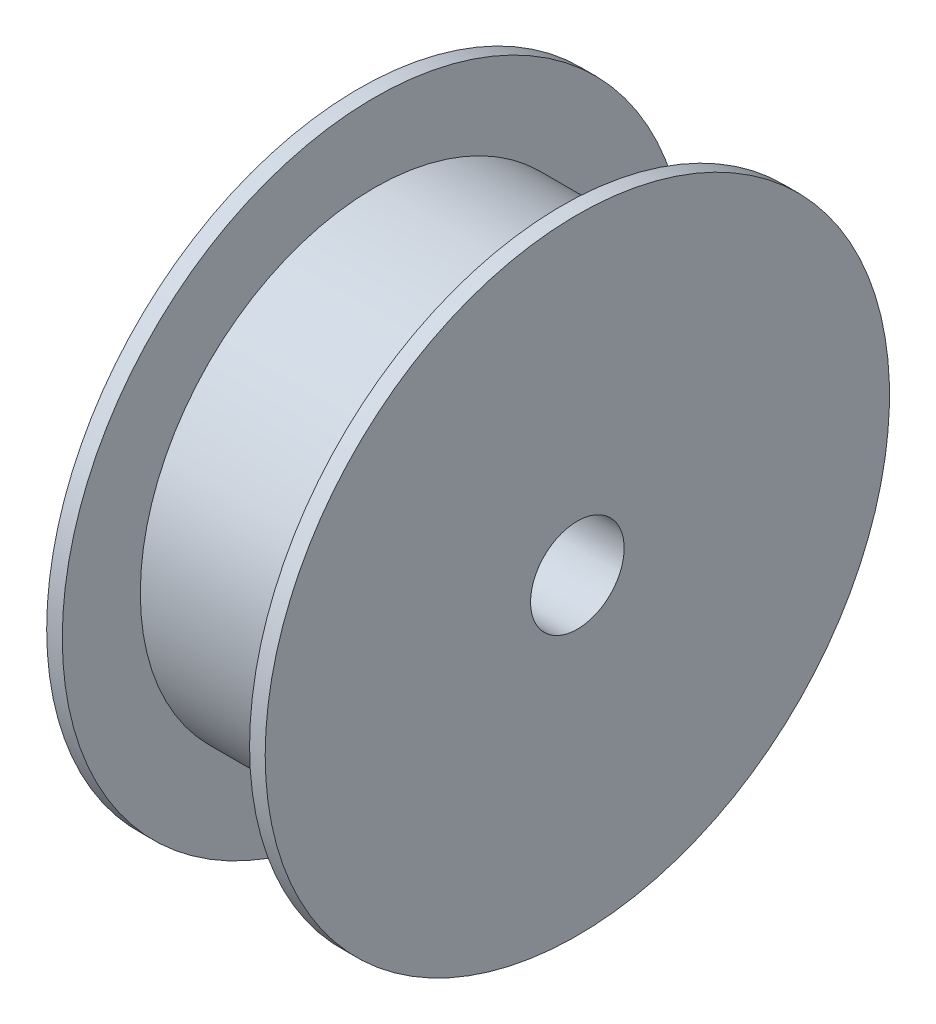
ISO-10303-21;
HEADER;
FILE_DESCRIPTION(('STEP AP214'),'2;1');
FILE_NAME('part.step','',(''),(''),'','','');
FILE_SCHEMA(('AUTOMOTIVE_DESIGN { 1 0 10303 214 1 1 1 1 }'));
ENDSEC;
DATA;
#1=APPLICATION_CONTEXT('core data for automotive mechanical design processes');
#2=APPLICATION_PROTOCOL_DEFINITION('international standard','automotive_design',2000,#1);
#3=PRODUCT_CONTEXT('',#1,'mechanical');
#4=PRODUCT('Part','Part','',(#3));
#5=PRODUCT_RELATED_PRODUCT_CATEGORY('part','',(#4));
#6=PRODUCT_DEFINITION_FORMATION('','',#4);
#7=PRODUCT_DEFINITION_CONTEXT('part definition',#1,'design');
#8=PRODUCT_DEFINITION('design','',#6,#7);
#9=PRODUCT_DEFINITION_SHAPE('','',#8);
#10=(LENGTH_UNIT() NAMED_UNIT(*) SI_UNIT(.MILLI.,.METRE.));
#11=(NAMED_UNIT(*) PLANE_ANGLE_UNIT() SI_UNIT($,.RADIAN.));
#12=(NAMED_UNIT(*) SI_UNIT($,.STERADIAN.) SOLID_ANGLE_UNIT());
#13=UNCERTAINTY_MEASURE_WITH_UNIT(LENGTH_MEASURE(1.E-05),#10,'distance_accuracy_value','');
#14=(GEOMETRIC_REPRESENTATION_CONTEXT(3) GLOBAL_UNCERTAINTY_ASSIGNED_CONTEXT((#13)) GLOBAL_UNIT_ASSIGNED_CONTEXT((#10,
#11,#12)) REPRESENTATION_CONTEXT('',''));
#15=CARTESIAN_POINT('',(0.,0.,0.));
#16=DIRECTION('',(0.,0.,1.));
#17=DIRECTION('',(1.,0.,0.));
#18=AXIS2_PLACEMENT_3D('',#15,#16,#17);
#19=CARTESIAN_POINT('',(-49.8494068842632,0.,20.0560361776407));
#20=DIRECTION('',(-1.,0.,0.));
#21=DIRECTION('',(0.,0.,1.));
#22=AXIS2_PLACEMENT_3D('',#19,#20,#21);
#23=CYLINDRICAL_SURFACE('',#22,20.);
#24=CARTESIAN_POINT('',(-44.7308545798672,0.,20.0560361776407));
#25=DIRECTION('',(-1.,0.,0.));
#26=DIRECTION('',(0.,0.,1.));
#27=AXIS2_PLACEMENT_3D('',#24,#25,#26);
#28=CIRCLE('',#27,20.);
#29=CARTESIAN_POINT('',(-44.7308545798672,0.,40.0560361776407));
#30=VERTEX_POINT('',#29);
#31=EDGE_CURVE('E63',#30,#30,#28,.T.);
#32=ORIENTED_EDGE('',*,*,#31,.F.);
#33=EDGE_LOOP('',(#32));
#34=FACE_BOUND('',#33,.T.);
#35=CARTESIAN_POINT('',(-43.7308545798672,0.,20.0560361776407));
#36=DIRECTION('',(-1.,0.,0.));
#37=DIRECTION('',(0.,0.,1.));
#38=AXIS2_PLACEMENT_3D('',#35,#36,#37);
#39=CIRCLE('',#38,20.);
#40=CARTESIAN_POINT('',(-43.7308545798672,0.,40.0560361776407));
#41=VERTEX_POINT('',#40);
#42=EDGE_CURVE('E10',#41,#41,#39,.T.);
#43=ORIENTED_EDGE('',*,*,#42,.T.);
#44=EDGE_LOOP('',(#43));
#45=FACE_BOUND('',#44,.T.);
#46=ADVANCED_FACE('F31',(#34,#45),#23,.T.);
#47=CARTESIAN_POINT('',(-43.7308545798672,0.,0.0560361776407448));
#48=DIRECTION('',(-1.,0.,0.));
#49=DIRECTION('',(0.,0.,1.));
#50=AXIS2_PLACEMENT_3D('',#47,#48,#49);
#51=PLANE('',#50);
#52=ORIENTED_EDGE('',*,*,#42,.F.);
#53=EDGE_LOOP('',(#52));
#54=FACE_BOUND('',#53,.T.);
#55=CARTESIAN_POINT('',(-43.7308545798672,0.,20.0560361776407));
#56=DIRECTION('',(-1.,0.,0.));
#57=DIRECTION('',(0.,0.,1.));
#58=AXIS2_PLACEMENT_3D('',#55,#56,#57);
#59=CIRCLE('',#58,15.);
#60=CARTESIAN_POINT('',(-43.7308545798672,0.,35.0560361776407));
#61=VERTEX_POINT('',#60);
#62=EDGE_CURVE('E42',#61,#61,#59,.T.);
#63=ORIENTED_EDGE('',*,*,#62,.T.);
#64=EDGE_LOOP('',(#63));
#65=FACE_BOUND('',#64,.T.);
#66=ADVANCED_FACE('F101',(#54,#65),#51,.F.);
#67=CARTESIAN_POINT('',(-49.8494068842632,0.,20.0560361776407));
#68=DIRECTION('',(-1.,0.,0.));
#69=DIRECTION('',(0.,0.,1.));
#70=AXIS2_PLACEMENT_3D('',#67,#68,#69);
#71=CYLINDRICAL_SURFACE('',#70,15.);
#72=CARTESIAN_POINT('',(-37.7308545798672,-14.9144225500017,21.6560361776407));
#73=CARTESIAN_POINT('',(-37.6412565888924,-14.9144236655933,21.6560323127364));
#74=CARTESIAN_POINT('',(-37.5516001486898,-14.9152386417625,21.6484847560006));
#75=CARTESIAN_POINT('',(-37.3747753240401,-14.9184098476283,21.6184913808744));
#76=CARTESIAN_POINT('',(-37.2876097544806,-14.9207677542496,21.5960293523893));
#77=CARTESIAN_POINT('',(-37.1183528283659,-14.9267547699762,21.5368705670349));
#78=CARTESIAN_POINT('',(-37.0362583425626,-14.9303830857339,21.5001826924183));
#79=CARTESIAN_POINT('',(-36.8794093412271,-14.9385011292845,21.4136312202387));
#80=CARTESIAN_POINT('',(-36.8046534216364,-14.9429906918111,21.3637701498155));
#81=CARTESIAN_POINT('',(-36.6642787395788,-14.9523460689031,21.2520673578389));
#82=CARTESIAN_POINT('',(-36.5986944731294,-14.9572132022761,21.1901823919092));
#83=CARTESIAN_POINT('',(-36.4788220851314,-14.9667633778283,21.0562811269401));
#84=CARTESIAN_POINT('',(-36.4245344912235,-14.9714464114003,20.9842643549312));
#85=CARTESIAN_POINT('',(-36.3286759368629,-14.9801139039791,20.8319308435279));
#86=CARTESIAN_POINT('',(-36.2871357055182,-14.9840966651839,20.7515946624799));
#87=CARTESIAN_POINT('',(-36.2181476904811,-14.9909004707378,20.585037492711));
#88=CARTESIAN_POINT('',(-36.1906995194533,-14.9937215470167,20.4988166658096));
#89=CARTESIAN_POINT('',(-36.1507764975354,-14.9978748574594,20.3232875577804));
#90=CARTESIAN_POINT('',(-36.1382447767579,-14.9992127450233,20.2339923472546));
#91=CARTESIAN_POINT('',(-36.1283343494322,-15.0002681826757,20.0545568302117));
#92=CARTESIAN_POINT('',(-36.1309552000684,-14.9999857801152,19.9644165484678));
#93=CARTESIAN_POINT('',(-36.1512295000159,-14.9978370703299,19.7862359121619));
#94=CARTESIAN_POINT('',(-36.168821795094,-14.9959772067036,19.6981885105843));
#95=CARTESIAN_POINT('',(-36.2184442527998,-14.9908899262437,19.5263031148105));
#96=CARTESIAN_POINT('',(-36.250474624907,-14.9876624895682,19.4424651817084));
#97=CARTESIAN_POINT('',(-36.3281305677545,-14.9801917630767,19.2811866509887));
#98=CARTESIAN_POINT('',(-36.3737830534523,-14.9759464654356,19.203759109756));
#99=CARTESIAN_POINT('',(-36.4773677663219,-14.9669160371749,19.0576417042459));
#100=CARTESIAN_POINT('',(-36.5353004035534,-14.962130888531,18.9889521318701));
#101=CARTESIAN_POINT('',(-36.662144514172,-14.9525292725756,18.8619020477762));
#102=CARTESIAN_POINT('',(-36.7311092110492,-14.9477127679481,18.803594663104));
#103=CARTESIAN_POINT('',(-36.877875674098,-14.9386149965148,18.699375784939));
#104=CARTESIAN_POINT('',(-36.9556774561651,-14.9343337306718,18.6534643137436));
#105=CARTESIAN_POINT('',(-37.1179520033578,-14.9267909175718,18.5753399745346));
#106=CARTESIAN_POINT('',(-37.2024264760579,-14.9235296323989,18.5431306265151));
#107=CARTESIAN_POINT('',(-37.3756272299974,-14.9184013871239,18.4933681173521));
#108=CARTESIAN_POINT('',(-37.4643533633038,-14.9165343785466,18.4758144466671));
#109=CARTESIAN_POINT('',(-37.6430717421569,-14.9144146003332,18.4559304092112));
#110=CARTESIAN_POINT('',(-37.7330556165361,-14.914153938196,18.4535256098236));
#111=CARTESIAN_POINT('',(-37.9121450214029,-14.9152555286042,18.4638118773613));
#112=CARTESIAN_POINT('',(-38.0012505654055,-14.9166177561386,18.4765027116408));
#113=CARTESIAN_POINT('',(-38.1758354801393,-14.9208044527218,18.5165576276903));
#114=CARTESIAN_POINT('',(-38.2613230649851,-14.9236253932699,18.5438863074639));
#115=CARTESIAN_POINT('',(-38.4265011121702,-14.9304088072498,18.6124049388579));
#116=CARTESIAN_POINT('',(-38.5061914240119,-14.9343713103036,18.6535952501712));
#117=CARTESIAN_POINT('',(-38.6578514629253,-14.9430104351993,18.7488535148471));
#118=CARTESIAN_POINT('',(-38.7297901321486,-14.9476897601603,18.8029706661976));
#119=CARTESIAN_POINT('',(-38.8635893871637,-14.9572265334338,18.9224761470013));
#120=CARTESIAN_POINT('',(-38.9254496886995,-14.9620839867655,18.9878647942552));
#121=CARTESIAN_POINT('',(-39.037594077137,-14.9714536371823,19.1283805843653));
#122=CARTESIAN_POINT('',(-39.0878295202163,-14.9759643325541,19.2035466635937));
#123=CARTESIAN_POINT('',(-39.1749630080714,-14.9841102341174,19.3612920433897));
#124=CARTESIAN_POINT('',(-39.2118612572873,-14.9877454537285,19.4438712303009));
#125=CARTESIAN_POINT('',(-39.2711910403719,-14.9937240629098,19.6139309143894));
#126=CARTESIAN_POINT('',(-39.2936516420748,-14.9960700467537,19.7014011755621));
#127=CARTESIAN_POINT('',(-39.3235633531027,-14.9992165342767,19.8788978045657));
#128=CARTESIAN_POINT('',(-39.3310149465423,-15.0000170878034,19.9689240898571));
#129=CARTESIAN_POINT('',(-39.3306897683637,-14.9999824379928,20.1485001655406));
#130=CARTESIAN_POINT('',(-39.3229883842556,-14.9991553324116,20.2380501035077));
#131=CARTESIAN_POINT('',(-39.2927343370414,-14.9959742980278,20.4145760913493));
#132=CARTESIAN_POINT('',(-39.2701816669227,-14.9936203685045,20.5015521400084));
#133=CARTESIAN_POINT('',(-39.2108868324186,-14.9876492980642,20.6704585051961));
#134=CARTESIAN_POINT('',(-39.1741472288251,-14.9840323851315,20.7523897292405));
#135=CARTESIAN_POINT('',(-39.0875293559588,-14.9759378682743,20.9089348387753));
#136=CARTESIAN_POINT('',(-39.0376511055162,-14.9714602655833,20.9835487347525));
#137=CARTESIAN_POINT('',(-38.9258898303516,-14.9621189097809,21.1237273565908));
#138=CARTESIAN_POINT('',(-38.8639506378233,-14.9572534154219,21.1892471864386));
#139=CARTESIAN_POINT('',(-38.7299386060694,-14.9476992164899,21.3089953406162));
#140=CARTESIAN_POINT('',(-38.6578633473456,-14.9430105544671,21.3632209613069));
#141=CARTESIAN_POINT('',(-38.5053963885181,-14.9343265816053,21.458966837947));
#142=CARTESIAN_POINT('',(-38.4249815241576,-14.9303332892578,21.5004503644136));
#143=CARTESIAN_POINT('',(-38.258334463341,-14.9235160982773,21.569269161836));
#144=CARTESIAN_POINT('',(-38.1721088938709,-14.9206908928619,21.5966202518801));
#145=CARTESIAN_POINT('',(-38.0263131951117,-14.9172357939645,21.6296435128485));
#146=CARTESIAN_POINT('',(-37.9676723529666,-14.916185880525,21.6395270656153));
#147=CARTESIAN_POINT('',(-37.8496477639283,-14.9147788904034,21.6527246630897));
#148=CARTESIAN_POINT('',(-37.7902640207155,-14.9144218102902,21.65603874033));
#149=CARTESIAN_POINT('',(-37.7308545798672,-14.9144225500017,21.6560361776407));
#150=B_SPLINE_CURVE_WITH_KNOTS('',3,(#72,#73,#74,#75,#76,#77,#78,#79,#80,#81,#82,#83,#84,#85,
#86,#87,#88,#89,#90,#91,#92,#93,#94,#95,#96,#97,#98,#99,#100,#101,#102,#103,#104,#105,#106,#107,
#108,#109,#110,#111,#112,#113,#114,#115,#116,#117,#118,#119,#120,#121,#122,#123,#124,#125,#126,
#127,#128,#129,#130,#131,#132,#133,#134,#135,#136,#137,#138,#139,#140,#141,#142,#143,#144,#145,
#146,#147,#148,#149),.UNSPECIFIED.,.T.,.F.,(4,2,2,2,2,2,2,2,2,2,2,2,2,2,2,2,2,2,2,2,2,2,2,2,2,2,
2,2,2,2,2,2,2,2,2,2,2,2,4),(0.,0.268577001529124,0.537446390261954,0.806148173479042,
1.07479844645294,1.34443343913401,1.61408102300266,1.88437361023824,2.15465876779301,
2.42391011167973,2.69315358705864,2.96130252668383,3.22945535696219,3.49814155961667,
3.76683673567383,4.03686964273638,4.30690303552161,4.57700575645424,4.84709908619821,
5.11586429481954,5.3846253614294,5.65273933841567,5.92086027317743,6.19001837516274,
6.4591840673222,6.72945648996832,6.99972476955153,7.26944718972389,7.53916090987708,
7.80753617116474,8.07591155917663,8.34423852710792,8.61256511047858,8.8821725404879,
9.15184443588199,9.42228652782287,9.69242524206732,9.87051058001084,10.0485950360567),.UNSPECIFIED.);
#151=CARTESIAN_POINT('',(-37.7308545798672,-14.9144225500017,21.6560361776407));
#152=VERTEX_POINT('',#151);
#153=EDGE_CURVE('E66',#152,#152,#150,.T.);
#154=ORIENTED_EDGE('',*,*,#153,.T.);
#155=EDGE_LOOP('',(#154));
#156=FACE_BOUND('',#155,.T.);
#157=ORIENTED_EDGE('',*,*,#62,.F.);
#158=EDGE_LOOP('',(#157));
#159=FACE_BOUND('',#158,.T.);
#160=CARTESIAN_POINT('',(-31.7308545798672,0.,20.0560361776407));
#161=DIRECTION('',(-1.,0.,0.));
#162=DIRECTION('',(0.,0.,1.));
#163=AXIS2_PLACEMENT_3D('',#160,#161,#162);
#164=CIRCLE('',#163,15.);
#165=CARTESIAN_POINT('',(-31.7308545798672,0.,35.0560361776407));
#166=VERTEX_POINT('',#165);
#167=EDGE_CURVE('E46',#166,#166,#164,.T.);
#168=ORIENTED_EDGE('',*,*,#167,.T.);
#169=EDGE_LOOP('',(#168));
#170=FACE_BOUND('',#169,.T.);
#171=ADVANCED_FACE('F71',(#156,#159,#170),#71,.T.);
#172=CARTESIAN_POINT('',(-31.7308545798672,0.,5.05603617764075));
#173=DIRECTION('',(1.,0.,0.));
#174=DIRECTION('',(0.,0.,-1.));
#175=AXIS2_PLACEMENT_3D('',#172,#173,#174);
#176=PLANE('',#175);
#177=ORIENTED_EDGE('',*,*,#167,.F.);
#178=EDGE_LOOP('',(#177));
#179=FACE_BOUND('',#178,.T.);
#180=CARTESIAN_POINT('',(-31.7308545798672,0.,20.0560361776407));
#181=DIRECTION('',(-1.,0.,0.));
#182=DIRECTION('',(0.,0.,1.));
#183=AXIS2_PLACEMENT_3D('',#180,#181,#182);
#184=CIRCLE('',#183,20.);
#185=CARTESIAN_POINT('',(-31.7308545798672,0.,40.0560361776407));
#186=VERTEX_POINT('',#185);
#187=EDGE_CURVE('E51',#186,#186,#184,.T.);
#188=ORIENTED_EDGE('',*,*,#187,.T.);
#189=EDGE_LOOP('',(#188));
#190=FACE_BOUND('',#189,.T.);
#191=ADVANCED_FACE('F94',(#179,#190),#176,.F.);
#192=CARTESIAN_POINT('',(-49.8494068842632,0.,20.0560361776407));
#193=DIRECTION('',(-1.,0.,0.));
#194=DIRECTION('',(0.,0.,1.));
#195=AXIS2_PLACEMENT_3D('',#192,#193,#194);
#196=CYLINDRICAL_SURFACE('',#195,20.);
#197=ORIENTED_EDGE('',*,*,#187,.F.);
#198=EDGE_LOOP('',(#197));
#199=FACE_BOUND('',#198,.T.);
#200=CARTESIAN_POINT('',(-30.7308545798672,0.,20.0560361776407));
#201=DIRECTION('',(-1.,0.,0.));
#202=DIRECTION('',(0.,0.,1.));
#203=AXIS2_PLACEMENT_3D('',#200,#201,#202);
#204=CIRCLE('',#203,20.);
#205=CARTESIAN_POINT('',(-30.7308545798672,0.,40.0560361776407));
#206=VERTEX_POINT('',#205);
#207=EDGE_CURVE('E54',#206,#206,#204,.T.);
#208=ORIENTED_EDGE('',*,*,#207,.T.);
#209=EDGE_LOOP('',(#208));
#210=FACE_BOUND('',#209,.T.);
#211=ADVANCED_FACE('F91',(#199,#210),#196,.T.);
#212=CARTESIAN_POINT('',(-30.7308545798672,0.,0.0560361776407448));
#213=DIRECTION('',(-1.,0.,0.));
#214=DIRECTION('',(0.,0.,1.));
#215=AXIS2_PLACEMENT_3D('',#212,#213,#214);
#216=PLANE('',#215);
#217=ORIENTED_EDGE('',*,*,#207,.F.);
#218=EDGE_LOOP('',(#217));
#219=FACE_BOUND('',#218,.T.);
#220=CARTESIAN_POINT('',(-30.7308545798672,0.,20.0560361776407));
#221=DIRECTION('',(-1.,0.,0.));
#222=DIRECTION('',(0.,0.,1.));
#223=AXIS2_PLACEMENT_3D('',#220,#221,#222);
#224=CIRCLE('',#223,3.);
#225=CARTESIAN_POINT('',(-30.7308545798672,0.,23.0560361776407));
#226=VERTEX_POINT('',#225);
#227=EDGE_CURVE('E57',#226,#226,#224,.T.);
#228=ORIENTED_EDGE('',*,*,#227,.T.);
#229=EDGE_LOOP('',(#228));
#230=FACE_BOUND('',#229,.T.);
#231=ADVANCED_FACE('F87',(#219,#230),#216,.F.);
#232=CARTESIAN_POINT('',(-49.8494068842632,0.,20.0560361776407));
#233=DIRECTION('',(-1.,0.,0.));
#234=DIRECTION('',(0.,0.,1.));
#235=AXIS2_PLACEMENT_3D('',#232,#233,#234);
#236=CYLINDRICAL_SURFACE('',#235,3.);
#237=CARTESIAN_POINT('',(-37.7308545798672,-2.53771550808991,21.6560361776407));
#238=CARTESIAN_POINT('',(-37.8133291109379,-2.53772393406364,21.6560299066694));
#239=CARTESIAN_POINT('',(-37.8958871450626,-2.54179889267039,21.6496155074785));
#240=CARTESIAN_POINT('',(-38.0583962145882,-2.55747842808691,21.6243187596731));
#241=CARTESIAN_POINT('',(-38.1383422280576,-2.56909670494034,21.6054137246795));
#242=CARTESIAN_POINT('',(-38.2929589784302,-2.59811808393787,21.5562309701328));
#243=CARTESIAN_POINT('',(-38.3676578464484,-2.61548693810715,21.5260204456603));
#244=CARTESIAN_POINT('',(-38.510903040982,-2.65399774393998,21.4552906909458));
#245=CARTESIAN_POINT('',(-38.5794483675648,-2.67514030715828,21.4147697893846));
#246=CARTESIAN_POINT('',(-38.715584321778,-2.72125117018077,21.3200836813734));
#247=CARTESIAN_POINT('',(-38.7824711791149,-2.74639217607543,21.264990337683));
#248=CARTESIAN_POINT('',(-38.9066144693172,-2.79627920363343,21.1446446352452));
#249=CARTESIAN_POINT('',(-38.9638654904358,-2.82102499632022,21.0793866070849));
#250=CARTESIAN_POINT('',(-39.071574657024,-2.86967596680657,20.9342522733625));
#251=CARTESIAN_POINT('',(-39.1211336604137,-2.89335873670358,20.8536269933754));
#252=CARTESIAN_POINT('',(-39.2056586269121,-2.93490870170679,20.6836817275102));
#253=CARTESIAN_POINT('',(-39.2406350496267,-2.95278006311368,20.5943680304558));
#254=CARTESIAN_POINT('',(-39.2921012867139,-2.97943742818159,20.4170652068426));
#255=CARTESIAN_POINT('',(-39.3098350194684,-2.98883049226817,20.3295305888759));
#256=CARTESIAN_POINT('',(-39.3304435008519,-2.99976727249257,20.1522671237506));
#257=CARTESIAN_POINT('',(-39.333328707082,-3.00131651290873,20.062539865598));
#258=CARTESIAN_POINT('',(-39.3245582876511,-2.99664573852507,19.8929361777364));
#259=CARTESIAN_POINT('',(-39.3143086481941,-2.99117687625849,19.8129609552491));
#260=CARTESIAN_POINT('',(-39.282124251316,-2.97426467697561,19.656066241814));
#261=CARTESIAN_POINT('',(-39.2601886059384,-2.96282088595806,19.5791469835498));
#262=CARTESIAN_POINT('',(-39.2052015157862,-2.93481417272145,19.4293395338772));
#263=CARTESIAN_POINT('',(-39.1720199189211,-2.91819150486987,19.3565107479319));
#264=CARTESIAN_POINT('',(-39.0957095356393,-2.88126966802788,19.2172995654986));
#265=CARTESIAN_POINT('',(-39.0525774114209,-2.86096926587115,19.1509193427564));
#266=CARTESIAN_POINT('',(-38.9524878699046,-2.81605817372031,19.0191421651843));
#267=CARTESIAN_POINT('',(-38.8945612531171,-2.79121882485554,18.9545590344346));
#268=CARTESIAN_POINT('',(-38.7690814210516,-2.74127710464253,18.8355553509968));
#269=CARTESIAN_POINT('',(-38.7015191565041,-2.7161745068325,18.7811444637948));
#270=CARTESIAN_POINT('',(-38.5522017958493,-2.66632287248061,18.679750699116));
#271=CARTESIAN_POINT('',(-38.4697462429289,-2.64175951899934,18.6336982405269));
#272=CARTESIAN_POINT('',(-38.2966973976476,-2.59869198610644,18.5564453021343));
#273=CARTESIAN_POINT('',(-38.2061134739231,-2.5801809423682,18.5252279784608));
#274=CARTESIAN_POINT('',(-38.0270088519747,-2.5535330411015,18.4812069915379));
#275=CARTESIAN_POINT('',(-37.9389170228512,-2.54467635048958,18.4671148730164));
#276=CARTESIAN_POINT('',(-37.7612102406844,-2.53635141290432,18.4538515857176));
#277=CARTESIAN_POINT('',(-37.6715968489098,-2.53687406220241,18.4546659485004));
#278=CARTESIAN_POINT('',(-37.5061326480194,-2.54648293181075,18.470011024521));
#279=CARTESIAN_POINT('',(-37.4300327395979,-2.55442428651191,18.4827083964332));
#280=CARTESIAN_POINT('',(-37.2812322056786,-2.57618644887237,18.518603041831));
#281=CARTESIAN_POINT('',(-37.2085329252446,-2.59000956150206,18.541804431908));
#282=CARTESIAN_POINT('',(-37.0648814885139,-2.62267056864907,18.5990783854999));
#283=CARTESIAN_POINT('',(-36.9941492757251,-2.64170343208955,18.6335868741466));
#284=CARTESIAN_POINT('',(-36.8590577645035,-2.68251285406401,18.7121303090477));
#285=CARTESIAN_POINT('',(-36.7947017326615,-2.70429080608964,18.7561701018848));
#286=CARTESIAN_POINT('',(-36.6642652490294,-2.75198135746187,18.8600749639396));
#287=CARTESIAN_POINT('',(-36.5993250618282,-2.77803074290395,18.9213152073479));
#288=CARTESIAN_POINT('',(-36.4802198041923,-2.82863553295298,19.0541024543189));
#289=CARTESIAN_POINT('',(-36.4260600810963,-2.85319019197299,19.1256545425898));
#290=CARTESIAN_POINT('',(-36.3280128043453,-2.89931282442356,19.2809210810237));
#291=CARTESIAN_POINT('',(-36.2846456947009,-2.92071426428043,19.3650174059517));
#292=CARTESIAN_POINT('',(-36.2131304995985,-2.95677658115708,19.5407791021462));
#293=CARTESIAN_POINT('',(-36.1849673599917,-2.97144412355686,19.6324368823913));
#294=CARTESIAN_POINT('',(-36.1473728338398,-2.99118504366419,19.8109509297519));
#295=CARTESIAN_POINT('',(-36.1363647758501,-2.99706359960554,19.8973859772002));
#296=CARTESIAN_POINT('',(-36.1285690764693,-3.00121718486538,20.0710631107304));
#297=CARTESIAN_POINT('',(-36.1317748950895,-2.99949571105761,20.1583048072273));
#298=CARTESIAN_POINT('',(-36.1513715103397,-2.98909841900028,20.3236141667994));
#299=CARTESIAN_POINT('',(-36.1666715370143,-2.98099812267503,20.4018518979214));
#300=CARTESIAN_POINT('',(-36.2084171507688,-2.95930708313303,20.5544799333691));
#301=CARTESIAN_POINT('',(-36.2348641489045,-2.94571564482098,20.6288697492619));
#302=CARTESIAN_POINT('',(-36.2991226972418,-2.91359804685995,20.7748879565365));
#303=CARTESIAN_POINT('',(-36.3373251953738,-2.89490512671529,20.8463064294749));
#304=CARTESIAN_POINT('',(-36.4235297840858,-2.85440903286553,20.9819788213697));
#305=CARTESIAN_POINT('',(-36.4715360982665,-2.83260451987285,21.0462296339034));
#306=CARTESIAN_POINT('',(-36.5820809762831,-2.7851245205132,21.1732511221447));
#307=CARTESIAN_POINT('',(-36.6456385326913,-2.75928737354848,21.2350763229018));
#308=CARTESIAN_POINT('',(-36.7823458025503,-2.70843945478522,21.3476160655954));
#309=CARTESIAN_POINT('',(-36.8555059694355,-2.6834296212971,21.3983183360246));
#310=CARTESIAN_POINT('',(-37.0143116893172,-2.63579050843057,21.4897051571869));
#311=CARTESIAN_POINT('',(-37.1004178294469,-2.61336238806767,21.5297018777214));
#312=CARTESIAN_POINT('',(-37.2796843009572,-2.57603769082298,21.5940355671799));
#313=CARTESIAN_POINT('',(-37.3728204267245,-2.56111651466168,21.6184237556762));
#314=CARTESIAN_POINT('',(-37.5111025922776,-2.54684334224821,21.641485447108));
#315=CARTESIAN_POINT('',(-37.5547954774231,-2.54343739328984,21.6469304354924));
#316=CARTESIAN_POINT('',(-37.6426024524649,-2.53887117922725,21.6542075468544));
#317=CARTESIAN_POINT('',(-37.6867165581706,-2.53771099874858,21.6560395336861));
#318=CARTESIAN_POINT('',(-37.7308545798672,-2.53771550808991,21.6560361776407));
#319=B_SPLINE_CURVE_WITH_KNOTS('',3,(#237,#238,#239,#240,#241,#242,#243,#244,#245,#246,#247,
#248,#249,#250,#251,#252,#253,#254,#255,#256,#257,#258,#259,#260,#261,#262,#263,#264,#265,#266,
#267,#268,#269,#270,#271,#272,#273,#274,#275,#276,#277,#278,#279,#280,#281,#282,#283,#284,#285,
#286,#287,#288,#289,#290,#291,#292,#293,#294,#295,#296,#297,#298,#299,#300,#301,#302,#303,#304,
#305,#306,#307,#308,#309,#310,#311,#312,#313,#314,#315,#316,#317,#318),.UNSPECIFIED.,.T.,.F.,(4,
2,2,2,2,2,2,2,2,2,2,2,2,2,2,2,2,2,2,2,2,2,2,2,2,2,2,2,2,2,2,2,2,2,2,2,2,2,2,2,4),(0.,
0.247236947174773,0.494924182632611,0.741162065387765,0.98743988892694,1.25701617256928,
1.52674335596951,1.81786745875611,2.10878238704998,2.37667542174061,2.64437975742191,
2.88568250515368,3.12700359079371,3.37121873440958,3.61551591689504,3.88511401850531,
4.15496699977605,4.44620613475032,4.73711380091717,5.00441947808848,5.27146571838896,
5.50309713228813,5.73481940269525,5.97680341191484,6.21891075815245,6.49665128670812,
6.77452923901575,7.0639555386163,7.35309473588111,7.61364749838932,7.87408038963904,
8.1133848973417,8.35271970686208,8.60107981850482,8.84954715321505,9.12542892067869,
9.40161354419161,9.69269476285075,9.98281583025835,10.1151250220935,10.2474391995363),.UNSPECIFIED.);
#320=CARTESIAN_POINT('',(-37.7308545798672,-2.53771550808991,21.6560361776407));
#321=VERTEX_POINT('',#320);
#322=EDGE_CURVE('E34',#321,#321,#319,.T.);
#323=ORIENTED_EDGE('',*,*,#322,.T.);
#324=EDGE_LOOP('',(#323));
#325=FACE_BOUND('',#324,.T.);
#326=ORIENTED_EDGE('',*,*,#227,.F.);
#327=EDGE_LOOP('',(#326));
#328=FACE_BOUND('',#327,.T.);
#329=CARTESIAN_POINT('',(-44.7308545798672,0.,20.0560361776407));
#330=DIRECTION('',(-1.,0.,0.));
#331=DIRECTION('',(0.,0.,1.));
#332=AXIS2_PLACEMENT_3D('',#329,#330,#331);
#333=CIRCLE('',#332,3.);
#334=CARTESIAN_POINT('',(-44.7308545798672,0.,23.0560361776407));
#335=VERTEX_POINT('',#334);
#336=EDGE_CURVE('E60',#335,#335,#333,.T.);
#337=ORIENTED_EDGE('',*,*,#336,.T.);
#338=EDGE_LOOP('',(#337));
#339=FACE_BOUND('',#338,.T.);
#340=ADVANCED_FACE('F82',(#325,#328,#339),#236,.F.);
#341=CARTESIAN_POINT('',(-44.7308545798672,0.,0.0560361776407448));
#342=DIRECTION('',(1.,0.,0.));
#343=DIRECTION('',(0.,0.,-1.));
#344=AXIS2_PLACEMENT_3D('',#341,#342,#343);
#345=PLANE('',#344);
#346=ORIENTED_EDGE('',*,*,#336,.F.);
#347=EDGE_LOOP('',(#346));
#348=FACE_BOUND('',#347,.T.);
#349=ORIENTED_EDGE('',*,*,#31,.T.);
#350=EDGE_LOOP('',(#349));
#351=FACE_BOUND('',#350,.T.);
#352=ADVANCED_FACE('F78',(#348,#351),#345,.F.);
#353=CARTESIAN_POINT('',(-37.7308545798672,-20.,20.0560361776407));
#354=DIRECTION('',(0.,1.,0.));
#355=DIRECTION('',(0.,0.,1.));
#356=AXIS2_PLACEMENT_3D('',#353,#354,#355);
#357=CYLINDRICAL_SURFACE('',#356,1.6);
#358=ORIENTED_EDGE('',*,*,#322,.F.);
#359=EDGE_LOOP('',(#358));
#360=FACE_BOUND('',#359,.T.);
#361=ORIENTED_EDGE('',*,*,#153,.F.);
#362=EDGE_LOOP('',(#361));
#363=FACE_BOUND('',#362,.T.);
#364=ADVANCED_FACE('F74',(#360,#363),#357,.F.);
#365=CLOSED_SHELL('',(#46,#66,#171,#191,#211,#231,#340,#352,#364));
#366=MANIFOLD_SOLID_BREP('B2',#365);
#367=ADVANCED_BREP_SHAPE_REPRESENTATION('',(#18,#366),#14);
#368=SHAPE_DEFINITION_REPRESENTATION(#9,#367);
ENDSEC;
END-ISO-10303-21;
